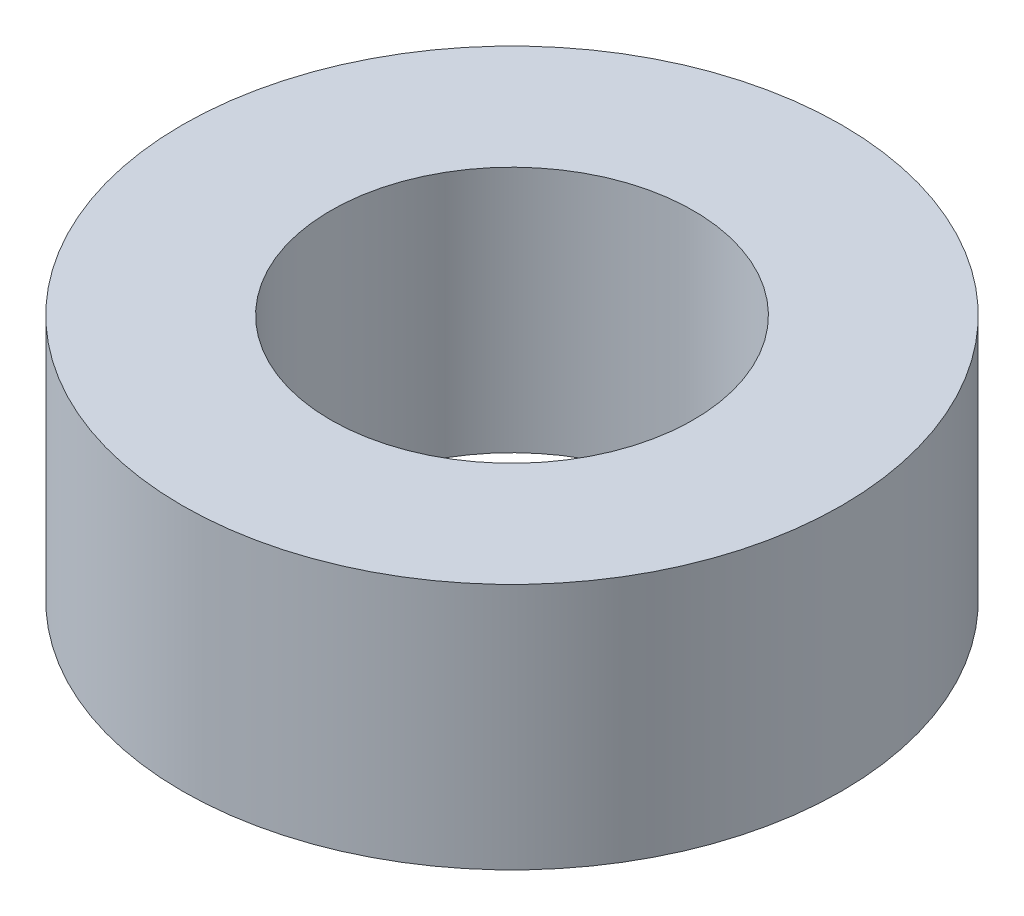
ISO-10303-21;
HEADER;
FILE_DESCRIPTION(('STEP AP214'),'2;1');
FILE_NAME('part.step','',(''),(''),'','','');
FILE_SCHEMA(('AUTOMOTIVE_DESIGN { 1 0 10303 214 1 1 1 1 }'));
ENDSEC;
DATA;
#1=APPLICATION_CONTEXT('core data for automotive mechanical design processes');
#2=APPLICATION_PROTOCOL_DEFINITION('international standard','automotive_design',2000,#1);
#3=PRODUCT_CONTEXT('',#1,'mechanical');
#4=PRODUCT('Part','Part','',(#3));
#5=PRODUCT_RELATED_PRODUCT_CATEGORY('part','',(#4));
#6=PRODUCT_DEFINITION_FORMATION('','',#4);
#7=PRODUCT_DEFINITION_CONTEXT('part definition',#1,'design');
#8=PRODUCT_DEFINITION('design','',#6,#7);
#9=PRODUCT_DEFINITION_SHAPE('','',#8);
#10=(LENGTH_UNIT() NAMED_UNIT(*) SI_UNIT(.MILLI.,.METRE.));
#11=(NAMED_UNIT(*) PLANE_ANGLE_UNIT() SI_UNIT($,.RADIAN.));
#12=(NAMED_UNIT(*) SI_UNIT($,.STERADIAN.) SOLID_ANGLE_UNIT());
#13=UNCERTAINTY_MEASURE_WITH_UNIT(LENGTH_MEASURE(1.E-05),#10,'distance_accuracy_value','');
#14=(GEOMETRIC_REPRESENTATION_CONTEXT(3) GLOBAL_UNCERTAINTY_ASSIGNED_CONTEXT((#13)) GLOBAL_UNIT_ASSIGNED_CONTEXT((#10,
#11,#12)) REPRESENTATION_CONTEXT('',''));
#15=CARTESIAN_POINT('',(0.,0.,0.));
#16=DIRECTION('',(0.,0.,1.));
#17=DIRECTION('',(1.,0.,0.));
#18=AXIS2_PLACEMENT_3D('',#15,#16,#17);
#19=CARTESIAN_POINT('',(0.,0.75,0.));
#20=DIRECTION('',(0.,1.,0.));
#21=DIRECTION('',(0.,0.,1.));
#22=AXIS2_PLACEMENT_3D('',#19,#20,#21);
#23=PLANE('',#22);
#24=CARTESIAN_POINT('',(0.,0.75,0.));
#25=DIRECTION('',(0.,1.,0.));
#26=DIRECTION('',(0.,0.,1.));
#27=AXIS2_PLACEMENT_3D('',#24,#25,#26);
#28=CIRCLE('',#27,2.);
#29=CARTESIAN_POINT('',(0.,0.75,2.));
#30=VERTEX_POINT('',#29);
#31=EDGE_CURVE('E10',#30,#30,#28,.T.);
#32=ORIENTED_EDGE('',*,*,#31,.T.);
#33=EDGE_LOOP('',(#32));
#34=FACE_BOUND('',#33,.T.);
#35=CARTESIAN_POINT('',(0.,0.75,0.));
#36=DIRECTION('',(0.,1.,0.));
#37=DIRECTION('',(0.,0.,1.));
#38=AXIS2_PLACEMENT_3D('',#35,#36,#37);
#39=CIRCLE('',#38,1.1);
#40=CARTESIAN_POINT('',(0.,0.75,1.1));
#41=VERTEX_POINT('',#40);
#42=EDGE_CURVE('E51',#41,#41,#39,.T.);
#43=ORIENTED_EDGE('',*,*,#42,.F.);
#44=EDGE_LOOP('',(#43));
#45=FACE_BOUND('',#44,.T.);
#46=ADVANCED_FACE('F38',(#34,#45),#23,.T.);
#47=CARTESIAN_POINT('',(0.,-0.75,0.));
#48=DIRECTION('',(0.,1.,0.));
#49=DIRECTION('',(0.,0.,1.));
#50=AXIS2_PLACEMENT_3D('',#47,#48,#49);
#51=PLANE('',#50);
#52=CARTESIAN_POINT('',(0.,-0.75,0.));
#53=DIRECTION('',(0.,1.,0.));
#54=DIRECTION('',(0.,0.,1.));
#55=AXIS2_PLACEMENT_3D('',#52,#53,#54);
#56=CIRCLE('',#55,2.);
#57=CARTESIAN_POINT('',(0.,-0.75,2.));
#58=VERTEX_POINT('',#57);
#59=EDGE_CURVE('E42',#58,#58,#56,.T.);
#60=ORIENTED_EDGE('',*,*,#59,.F.);
#61=EDGE_LOOP('',(#60));
#62=FACE_BOUND('',#61,.T.);
#63=CARTESIAN_POINT('',(0.,-0.75,0.));
#64=DIRECTION('',(0.,1.,0.));
#65=DIRECTION('',(0.,0.,1.));
#66=AXIS2_PLACEMENT_3D('',#63,#64,#65);
#67=CIRCLE('',#66,1.1);
#68=CARTESIAN_POINT('',(0.,-0.75,1.1));
#69=VERTEX_POINT('',#68);
#70=EDGE_CURVE('E53',#69,#69,#67,.T.);
#71=ORIENTED_EDGE('',*,*,#70,.T.);
#72=EDGE_LOOP('',(#71));
#73=FACE_BOUND('',#72,.T.);
#74=ADVANCED_FACE('F65',(#62,#73),#51,.F.);
#75=CARTESIAN_POINT('',(0.,0.75,0.));
#76=DIRECTION('',(0.,-1.,0.));
#77=DIRECTION('',(0.,0.,-1.));
#78=AXIS2_PLACEMENT_3D('',#75,#76,#77);
#79=CYLINDRICAL_SURFACE('',#78,2.);
#80=ORIENTED_EDGE('',*,*,#31,.F.);
#81=EDGE_LOOP('',(#80));
#82=FACE_BOUND('',#81,.T.);
#83=ORIENTED_EDGE('',*,*,#59,.T.);
#84=EDGE_LOOP('',(#83));
#85=FACE_BOUND('',#84,.T.);
#86=ADVANCED_FACE('F40',(#82,#85),#79,.T.);
#87=CARTESIAN_POINT('',(0.,0.75,0.));
#88=DIRECTION('',(0.,-1.,0.));
#89=DIRECTION('',(0.,0.,-1.));
#90=AXIS2_PLACEMENT_3D('',#87,#88,#89);
#91=CYLINDRICAL_SURFACE('',#90,1.1);
#92=ORIENTED_EDGE('',*,*,#42,.T.);
#93=EDGE_LOOP('',(#92));
#94=FACE_BOUND('',#93,.T.);
#95=ORIENTED_EDGE('',*,*,#70,.F.);
#96=EDGE_LOOP('',(#95));
#97=FACE_BOUND('',#96,.T.);
#98=ADVANCED_FACE('F61',(#94,#97),#91,.F.);
#99=CLOSED_SHELL('',(#46,#74,#86,#98));
#100=MANIFOLD_SOLID_BREP('B2',#99);
#101=ADVANCED_BREP_SHAPE_REPRESENTATION('',(#18,#100),#14);
#102=SHAPE_DEFINITION_REPRESENTATION(#9,#101);
ENDSEC;
END-ISO-10303-21;
